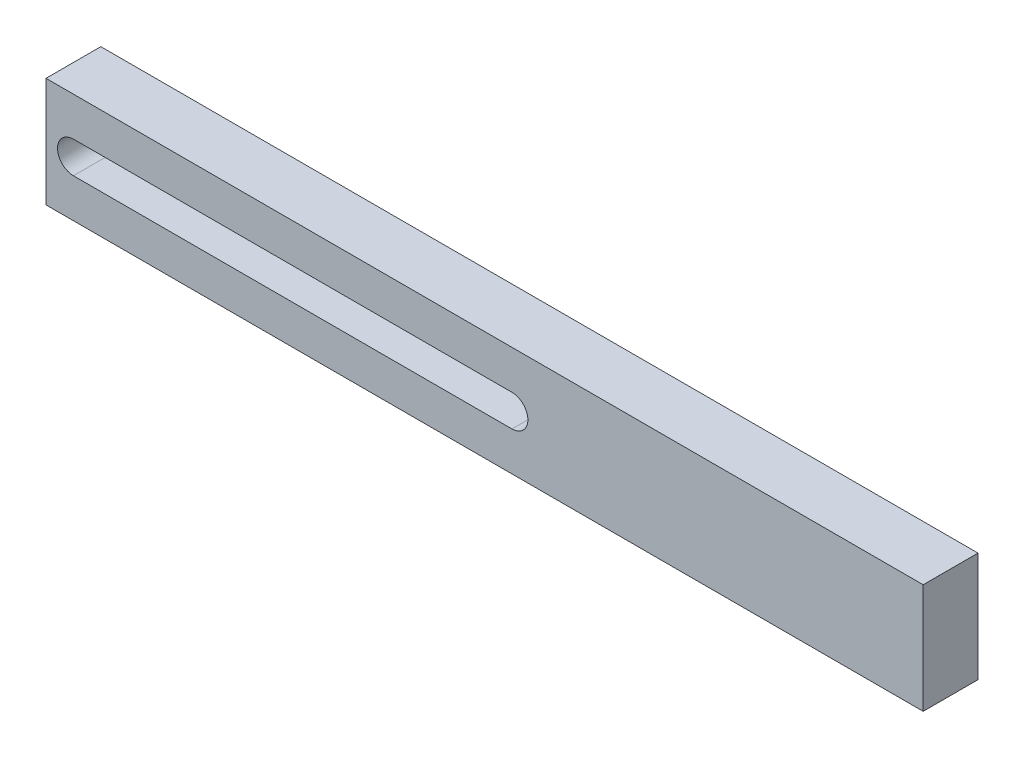
ISO-10303-21;
HEADER;
FILE_DESCRIPTION(('STEP AP214'),'2;1');
FILE_NAME('part.step','',(''),(''),'','','');
FILE_SCHEMA(('AUTOMOTIVE_DESIGN { 1 0 10303 214 1 1 1 1 }'));
ENDSEC;
DATA;
#1=APPLICATION_CONTEXT('core data for automotive mechanical design processes');
#2=APPLICATION_PROTOCOL_DEFINITION('international standard','automotive_design',2000,#1);
#3=PRODUCT_CONTEXT('',#1,'mechanical');
#4=PRODUCT('Part','Part','',(#3));
#5=PRODUCT_RELATED_PRODUCT_CATEGORY('part','',(#4));
#6=PRODUCT_DEFINITION_FORMATION('','',#4);
#7=PRODUCT_DEFINITION_CONTEXT('part definition',#1,'design');
#8=PRODUCT_DEFINITION('design','',#6,#7);
#9=PRODUCT_DEFINITION_SHAPE('','',#8);
#10=(LENGTH_UNIT() NAMED_UNIT(*) SI_UNIT(.MILLI.,.METRE.));
#11=(NAMED_UNIT(*) PLANE_ANGLE_UNIT() SI_UNIT($,.RADIAN.));
#12=(NAMED_UNIT(*) SI_UNIT($,.STERADIAN.) SOLID_ANGLE_UNIT());
#13=UNCERTAINTY_MEASURE_WITH_UNIT(LENGTH_MEASURE(1.E-05),#10,'distance_accuracy_value','');
#14=(GEOMETRIC_REPRESENTATION_CONTEXT(3) GLOBAL_UNCERTAINTY_ASSIGNED_CONTEXT((#13)) GLOBAL_UNIT_ASSIGNED_CONTEXT((#10,
#11,#12)) REPRESENTATION_CONTEXT('',''));
#15=CARTESIAN_POINT('',(0.,0.,0.));
#16=DIRECTION('',(0.,0.,1.));
#17=DIRECTION('',(1.,0.,0.));
#18=AXIS2_PLACEMENT_3D('',#15,#16,#17);
#19=CARTESIAN_POINT('',(101.6,-12.7,6.35));
#20=DIRECTION('',(-1.,0.,0.));
#21=DIRECTION('',(0.,0.,1.));
#22=AXIS2_PLACEMENT_3D('',#19,#20,#21);
#23=PLANE('',#22);
#24=DIRECTION('',(0.,1.,0.));
#25=VECTOR('',#24,1.);
#26=CARTESIAN_POINT('',(101.6,-12.7,-6.35));
#27=LINE('',#26,#25);
#28=CARTESIAN_POINT('',(101.6,-12.7,-6.35));
#29=VERTEX_POINT('',#28);
#30=CARTESIAN_POINT('',(101.6,12.7,-6.35));
#31=VERTEX_POINT('',#30);
#32=EDGE_CURVE('E145',#29,#31,#27,.T.);
#33=ORIENTED_EDGE('',*,*,#32,.T.);
#34=DIRECTION('',(0.,0.,-1.));
#35=VECTOR('',#34,1.);
#36=CARTESIAN_POINT('',(101.6,12.7,6.35));
#37=LINE('',#36,#35);
#38=CARTESIAN_POINT('',(101.6,12.7,6.35));
#39=VERTEX_POINT('',#38);
#40=EDGE_CURVE('E11',#39,#31,#37,.T.);
#41=ORIENTED_EDGE('',*,*,#40,.F.);
#42=DIRECTION('',(0.,1.,0.));
#43=VECTOR('',#42,1.);
#44=CARTESIAN_POINT('',(101.6,-12.7,6.35));
#45=LINE('',#44,#43);
#46=CARTESIAN_POINT('',(101.6,-12.7,6.35));
#47=VERTEX_POINT('',#46);
#48=EDGE_CURVE('E154',#47,#39,#45,.T.);
#49=ORIENTED_EDGE('',*,*,#48,.F.);
#50=DIRECTION('',(0.,0.,-1.));
#51=VECTOR('',#50,1.);
#52=CARTESIAN_POINT('',(101.6,-12.7,6.35));
#53=LINE('',#52,#51);
#54=EDGE_CURVE('E135',#47,#29,#53,.T.);
#55=ORIENTED_EDGE('',*,*,#54,.T.);
#56=EDGE_LOOP('',(#33,#41,#49,#55));
#57=FACE_BOUND('',#56,.T.);
#58=ADVANCED_FACE('F39',(#57),#23,.F.);
#59=CARTESIAN_POINT('',(-101.6,12.7,6.35));
#60=DIRECTION('',(0.,-1.,0.));
#61=DIRECTION('',(0.,0.,-1.));
#62=AXIS2_PLACEMENT_3D('',#59,#60,#61);
#63=PLANE('',#62);
#64=DIRECTION('',(-1.,0.,0.));
#65=VECTOR('',#64,1.);
#66=CARTESIAN_POINT('',(-101.6,12.7,-6.35));
#67=LINE('',#66,#65);
#68=CARTESIAN_POINT('',(-101.6,12.7,-6.35));
#69=VERTEX_POINT('',#68);
#70=EDGE_CURVE('E95',#31,#69,#67,.T.);
#71=ORIENTED_EDGE('',*,*,#70,.T.);
#72=DIRECTION('',(0.,0.,-1.));
#73=VECTOR('',#72,1.);
#74=CARTESIAN_POINT('',(-101.6,12.7,6.35));
#75=LINE('',#74,#73);
#76=CARTESIAN_POINT('',(-101.6,12.7,6.35));
#77=VERTEX_POINT('',#76);
#78=EDGE_CURVE('E48',#77,#69,#75,.T.);
#79=ORIENTED_EDGE('',*,*,#78,.F.);
#80=DIRECTION('',(-1.,0.,0.));
#81=VECTOR('',#80,1.);
#82=CARTESIAN_POINT('',(-101.6,12.7,6.35));
#83=LINE('',#82,#81);
#84=EDGE_CURVE('E118',#39,#77,#83,.T.);
#85=ORIENTED_EDGE('',*,*,#84,.F.);
#86=ORIENTED_EDGE('',*,*,#40,.T.);
#87=EDGE_LOOP('',(#71,#79,#85,#86));
#88=FACE_BOUND('',#87,.T.);
#89=ADVANCED_FACE('F192',(#88),#63,.F.);
#90=CARTESIAN_POINT('',(-101.6,-12.7,6.35));
#91=DIRECTION('',(1.,0.,0.));
#92=DIRECTION('',(0.,0.,-1.));
#93=AXIS2_PLACEMENT_3D('',#90,#91,#92);
#94=PLANE('',#93);
#95=DIRECTION('',(0.,-1.,0.));
#96=VECTOR('',#95,1.);
#97=CARTESIAN_POINT('',(-101.6,-12.7,-6.35));
#98=LINE('',#97,#96);
#99=CARTESIAN_POINT('',(-101.6,-12.7,-6.35));
#100=VERTEX_POINT('',#99);
#101=EDGE_CURVE('E103',#69,#100,#98,.T.);
#102=ORIENTED_EDGE('',*,*,#101,.T.);
#103=DIRECTION('',(0.,0.,-1.));
#104=VECTOR('',#103,1.);
#105=CARTESIAN_POINT('',(-101.6,-12.7,6.35));
#106=LINE('',#105,#104);
#107=CARTESIAN_POINT('',(-101.6,-12.7,6.35));
#108=VERTEX_POINT('',#107);
#109=EDGE_CURVE('E132',#108,#100,#106,.T.);
#110=ORIENTED_EDGE('',*,*,#109,.F.);
#111=DIRECTION('',(0.,-1.,0.));
#112=VECTOR('',#111,1.);
#113=CARTESIAN_POINT('',(-101.6,-12.7,6.35));
#114=LINE('',#113,#112);
#115=EDGE_CURVE('E126',#77,#108,#114,.T.);
#116=ORIENTED_EDGE('',*,*,#115,.F.);
#117=ORIENTED_EDGE('',*,*,#78,.T.);
#118=EDGE_LOOP('',(#102,#110,#116,#117));
#119=FACE_BOUND('',#118,.T.);
#120=ADVANCED_FACE('F133',(#119),#94,.F.);
#121=CARTESIAN_POINT('',(-101.6,-12.7,6.35));
#122=DIRECTION('',(0.,1.,0.));
#123=DIRECTION('',(0.,0.,1.));
#124=AXIS2_PLACEMENT_3D('',#121,#122,#123);
#125=PLANE('',#124);
#126=DIRECTION('',(1.,0.,0.));
#127=VECTOR('',#126,1.);
#128=CARTESIAN_POINT('',(-101.6,-12.7,-6.35));
#129=LINE('',#128,#127);
#130=EDGE_CURVE('E110',#100,#29,#129,.T.);
#131=ORIENTED_EDGE('',*,*,#130,.T.);
#132=ORIENTED_EDGE('',*,*,#54,.F.);
#133=DIRECTION('',(1.,0.,0.));
#134=VECTOR('',#133,1.);
#135=CARTESIAN_POINT('',(-101.6,-12.7,6.35));
#136=LINE('',#135,#134);
#137=EDGE_CURVE('E129',#108,#47,#136,.T.);
#138=ORIENTED_EDGE('',*,*,#137,.F.);
#139=ORIENTED_EDGE('',*,*,#109,.T.);
#140=EDGE_LOOP('',(#131,#132,#138,#139));
#141=FACE_BOUND('',#140,.T.);
#142=ADVANCED_FACE('F137',(#141),#125,.F.);
#143=CARTESIAN_POINT('',(0.,0.,6.35));
#144=DIRECTION('',(0.,0.,-1.));
#145=DIRECTION('',(-1.,0.,0.));
#146=AXIS2_PLACEMENT_3D('',#143,#144,#145);
#147=PLANE('',#146);
#148=DIRECTION('',(1.,0.,0.));
#149=VECTOR('',#148,1.);
#150=CARTESIAN_POINT('',(-95.25,-3.675,6.35));
#151=LINE('',#150,#149);
#152=CARTESIAN_POINT('',(-95.25,-3.675,6.35));
#153=VERTEX_POINT('',#152);
#154=CARTESIAN_POINT('',(6.35000000000004,-3.675,6.35));
#155=VERTEX_POINT('',#154);
#156=EDGE_CURVE('E158',#153,#155,#151,.T.);
#157=ORIENTED_EDGE('',*,*,#156,.F.);
#158=CARTESIAN_POINT('',(-95.25,0.,6.35));
#159=DIRECTION('',(0.,0.,1.));
#160=DIRECTION('',(1.,0.,0.));
#161=AXIS2_PLACEMENT_3D('',#158,#159,#160);
#162=CIRCLE('',#161,3.675);
#163=CARTESIAN_POINT('',(-95.25,3.675,6.35));
#164=VERTEX_POINT('',#163);
#165=EDGE_CURVE('E42',#164,#153,#162,.T.);
#166=ORIENTED_EDGE('',*,*,#165,.F.);
#167=DIRECTION('',(1.,0.,0.));
#168=VECTOR('',#167,1.);
#169=CARTESIAN_POINT('',(-95.25,3.675,6.35));
#170=LINE('',#169,#168);
#171=CARTESIAN_POINT('',(6.35000000000004,3.675,6.35));
#172=VERTEX_POINT('',#171);
#173=EDGE_CURVE('E86',#172,#164,#170,.F.);
#174=ORIENTED_EDGE('',*,*,#173,.F.);
#175=CARTESIAN_POINT('',(6.35000000000004,0.,6.35));
#176=DIRECTION('',(0.,0.,1.));
#177=DIRECTION('',(1.,0.,0.));
#178=AXIS2_PLACEMENT_3D('',#175,#176,#177);
#179=CIRCLE('',#178,3.675);
#180=EDGE_CURVE('E161',#155,#172,#179,.T.);
#181=ORIENTED_EDGE('',*,*,#180,.F.);
#182=EDGE_LOOP('',(#157,#166,#174,#181));
#183=FACE_BOUND('',#182,.T.);
#184=ORIENTED_EDGE('',*,*,#48,.T.);
#185=ORIENTED_EDGE('',*,*,#84,.T.);
#186=ORIENTED_EDGE('',*,*,#115,.T.);
#187=ORIENTED_EDGE('',*,*,#137,.T.);
#188=EDGE_LOOP('',(#184,#185,#186,#187));
#189=FACE_BOUND('',#188,.T.);
#190=ADVANCED_FACE('F127',(#183,#189),#147,.F.);
#191=CARTESIAN_POINT('',(0.,0.,-6.35));
#192=DIRECTION('',(0.,0.,-1.));
#193=DIRECTION('',(-1.,0.,0.));
#194=AXIS2_PLACEMENT_3D('',#191,#192,#193);
#195=PLANE('',#194);
#196=CARTESIAN_POINT('',(-95.25,0.,-6.35));
#197=DIRECTION('',(0.,0.,1.));
#198=DIRECTION('',(1.,0.,0.));
#199=AXIS2_PLACEMENT_3D('',#196,#197,#198);
#200=CIRCLE('',#199,3.675);
#201=CARTESIAN_POINT('',(-95.25,3.675,-6.35));
#202=VERTEX_POINT('',#201);
#203=CARTESIAN_POINT('',(-95.25,-3.675,-6.35));
#204=VERTEX_POINT('',#203);
#205=EDGE_CURVE('E265',#202,#204,#200,.T.);
#206=ORIENTED_EDGE('',*,*,#205,.T.);
#207=DIRECTION('',(1.,0.,0.));
#208=VECTOR('',#207,1.);
#209=CARTESIAN_POINT('',(-95.25,-3.675,-6.35));
#210=LINE('',#209,#208);
#211=CARTESIAN_POINT('',(6.35000000000004,-3.675,-6.35));
#212=VERTEX_POINT('',#211);
#213=EDGE_CURVE('E267',#204,#212,#210,.T.);
#214=ORIENTED_EDGE('',*,*,#213,.T.);
#215=CARTESIAN_POINT('',(6.35000000000004,0.,-6.35));
#216=DIRECTION('',(0.,0.,1.));
#217=DIRECTION('',(1.,0.,0.));
#218=AXIS2_PLACEMENT_3D('',#215,#216,#217);
#219=CIRCLE('',#218,3.675);
#220=CARTESIAN_POINT('',(6.35000000000004,3.675,-6.35));
#221=VERTEX_POINT('',#220);
#222=EDGE_CURVE('E65',#212,#221,#219,.T.);
#223=ORIENTED_EDGE('',*,*,#222,.T.);
#224=DIRECTION('',(-1.,0.,0.));
#225=VECTOR('',#224,1.);
#226=CARTESIAN_POINT('',(-95.25,3.675,-6.35));
#227=LINE('',#226,#225);
#228=EDGE_CURVE('E184',#221,#202,#227,.T.);
#229=ORIENTED_EDGE('',*,*,#228,.T.);
#230=EDGE_LOOP('',(#206,#214,#223,#229));
#231=FACE_BOUND('',#230,.T.);
#232=ORIENTED_EDGE('',*,*,#32,.F.);
#233=ORIENTED_EDGE('',*,*,#130,.F.);
#234=ORIENTED_EDGE('',*,*,#101,.F.);
#235=ORIENTED_EDGE('',*,*,#70,.F.);
#236=EDGE_LOOP('',(#232,#233,#234,#235));
#237=FACE_BOUND('',#236,.T.);
#238=ADVANCED_FACE('F193',(#231,#237),#195,.T.);
#239=CARTESIAN_POINT('',(-95.25,0.,-6.35));
#240=DIRECTION('',(0.,0.,1.));
#241=DIRECTION('',(1.,0.,0.));
#242=AXIS2_PLACEMENT_3D('',#239,#240,#241);
#243=CYLINDRICAL_SURFACE('',#242,3.675);
#244=DIRECTION('',(0.,0.,1.));
#245=VECTOR('',#244,1.);
#246=CARTESIAN_POINT('',(-95.25,-3.675,-6.35));
#247=LINE('',#246,#245);
#248=EDGE_CURVE('E56',#204,#153,#247,.T.);
#249=ORIENTED_EDGE('',*,*,#248,.F.);
#250=ORIENTED_EDGE('',*,*,#205,.F.);
#251=DIRECTION('',(0.,0.,1.));
#252=VECTOR('',#251,1.);
#253=CARTESIAN_POINT('',(-95.25,3.675,-6.35));
#254=LINE('',#253,#252);
#255=EDGE_CURVE('E162',#202,#164,#254,.T.);
#256=ORIENTED_EDGE('',*,*,#255,.T.);
#257=ORIENTED_EDGE('',*,*,#165,.T.);
#258=EDGE_LOOP('',(#249,#250,#256,#257));
#259=FACE_BOUND('',#258,.T.);
#260=ADVANCED_FACE('F169',(#259),#243,.F.);
#261=CARTESIAN_POINT('',(-95.25,3.675,-6.35));
#262=DIRECTION('',(0.,1.,0.));
#263=DIRECTION('',(0.,0.,1.));
#264=AXIS2_PLACEMENT_3D('',#261,#262,#263);
#265=PLANE('',#264);
#266=ORIENTED_EDGE('',*,*,#255,.F.);
#267=ORIENTED_EDGE('',*,*,#228,.F.);
#268=DIRECTION('',(0.,0.,1.));
#269=VECTOR('',#268,1.);
#270=CARTESIAN_POINT('',(6.35000000000004,3.675,-6.35));
#271=LINE('',#270,#269);
#272=EDGE_CURVE('E179',#221,#172,#271,.T.);
#273=ORIENTED_EDGE('',*,*,#272,.T.);
#274=ORIENTED_EDGE('',*,*,#173,.T.);
#275=EDGE_LOOP('',(#266,#267,#273,#274));
#276=FACE_BOUND('',#275,.T.);
#277=ADVANCED_FACE('F201',(#276),#265,.F.);
#278=CARTESIAN_POINT('',(6.35000000000004,0.,-6.35));
#279=DIRECTION('',(0.,0.,1.));
#280=DIRECTION('',(1.,0.,0.));
#281=AXIS2_PLACEMENT_3D('',#278,#279,#280);
#282=CYLINDRICAL_SURFACE('',#281,3.675);
#283=ORIENTED_EDGE('',*,*,#272,.F.);
#284=ORIENTED_EDGE('',*,*,#222,.F.);
#285=DIRECTION('',(0.,0.,1.));
#286=VECTOR('',#285,1.);
#287=CARTESIAN_POINT('',(6.35000000000004,-3.675,-6.35));
#288=LINE('',#287,#286);
#289=EDGE_CURVE('E175',#212,#155,#288,.T.);
#290=ORIENTED_EDGE('',*,*,#289,.T.);
#291=ORIENTED_EDGE('',*,*,#180,.T.);
#292=EDGE_LOOP('',(#283,#284,#290,#291));
#293=FACE_BOUND('',#292,.T.);
#294=ADVANCED_FACE('F177',(#293),#282,.F.);
#295=CARTESIAN_POINT('',(-95.25,-3.675,-6.35));
#296=DIRECTION('',(0.,-1.,0.));
#297=DIRECTION('',(0.,0.,-1.));
#298=AXIS2_PLACEMENT_3D('',#295,#296,#297);
#299=PLANE('',#298);
#300=ORIENTED_EDGE('',*,*,#289,.F.);
#301=ORIENTED_EDGE('',*,*,#213,.F.);
#302=ORIENTED_EDGE('',*,*,#248,.T.);
#303=ORIENTED_EDGE('',*,*,#156,.T.);
#304=EDGE_LOOP('',(#300,#301,#302,#303));
#305=FACE_BOUND('',#304,.T.);
#306=ADVANCED_FACE('F174',(#305),#299,.F.);
#307=CLOSED_SHELL('',(#58,#89,#120,#142,#190,#238,#260,#277,#294,#306));
#308=MANIFOLD_SOLID_BREP('B2',#307);
#309=ADVANCED_BREP_SHAPE_REPRESENTATION('',(#18,#308),#14);
#310=SHAPE_DEFINITION_REPRESENTATION(#9,#309);
ENDSEC;
END-ISO-10303-21;
